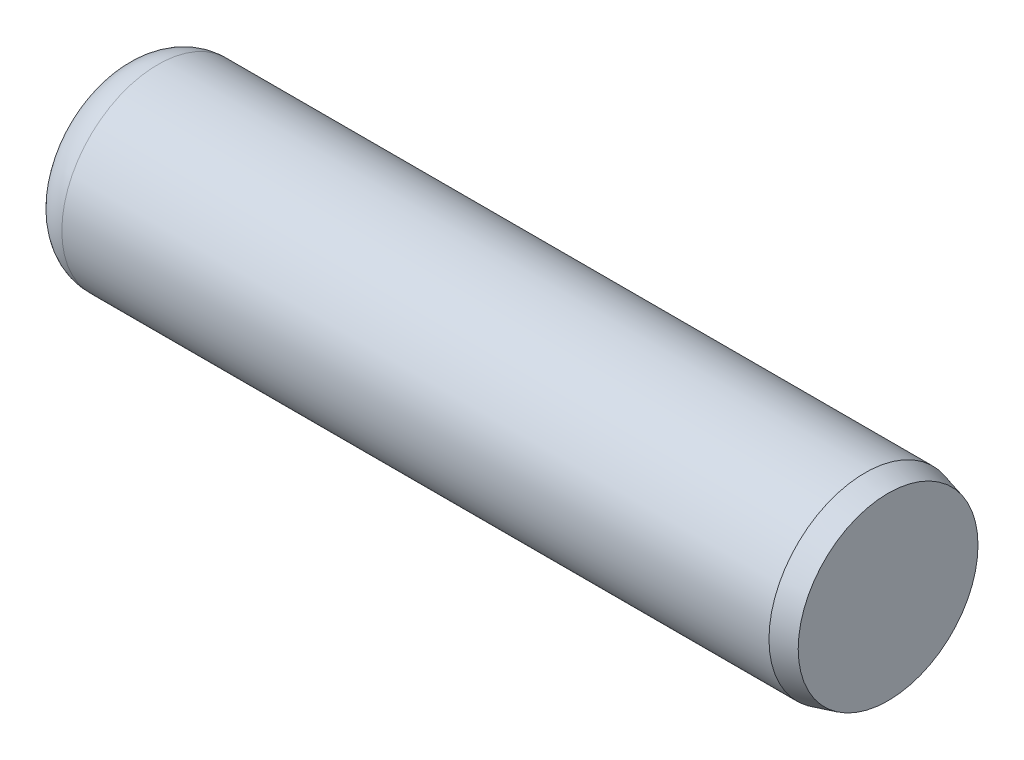
ISO-10303-21;
HEADER;
FILE_DESCRIPTION(('STEP AP214'),'2;1');
FILE_NAME('part.step','',(''),(''),'','','');
FILE_SCHEMA(('AUTOMOTIVE_DESIGN { 1 0 10303 214 1 1 1 1 }'));
ENDSEC;
DATA;
#1=APPLICATION_CONTEXT('core data for automotive mechanical design processes');
#2=APPLICATION_PROTOCOL_DEFINITION('international standard','automotive_design',2000,#1);
#3=PRODUCT_CONTEXT('',#1,'mechanical');
#4=PRODUCT('Part','Part','',(#3));
#5=PRODUCT_RELATED_PRODUCT_CATEGORY('part','',(#4));
#6=PRODUCT_DEFINITION_FORMATION('','',#4);
#7=PRODUCT_DEFINITION_CONTEXT('part definition',#1,'design');
#8=PRODUCT_DEFINITION('design','',#6,#7);
#9=PRODUCT_DEFINITION_SHAPE('','',#8);
#10=(LENGTH_UNIT() NAMED_UNIT(*) SI_UNIT(.MILLI.,.METRE.));
#11=(NAMED_UNIT(*) PLANE_ANGLE_UNIT() SI_UNIT($,.RADIAN.));
#12=(NAMED_UNIT(*) SI_UNIT($,.STERADIAN.) SOLID_ANGLE_UNIT());
#13=UNCERTAINTY_MEASURE_WITH_UNIT(LENGTH_MEASURE(1.E-05),#10,'distance_accuracy_value','');
#14=(GEOMETRIC_REPRESENTATION_CONTEXT(3) GLOBAL_UNCERTAINTY_ASSIGNED_CONTEXT((#13)) GLOBAL_UNIT_ASSIGNED_CONTEXT((#10,
#11,#12)) REPRESENTATION_CONTEXT('',''));
#15=CARTESIAN_POINT('',(0.,0.,0.));
#16=DIRECTION('',(0.,0.,1.));
#17=DIRECTION('',(1.,0.,0.));
#18=AXIS2_PLACEMENT_3D('',#15,#16,#17);
#19=CARTESIAN_POINT('',(0.,7.61999999999997,0.));
#20=DIRECTION('',(1.,0.,0.));
#21=DIRECTION('',(0.,0.,-1.));
#22=AXIS2_PLACEMENT_3D('',#19,#20,#21);
#23=PLANE('',#22);
#24=CARTESIAN_POINT('',(0.,0.,0.));
#25=DIRECTION('',(-1.,0.,0.));
#26=DIRECTION('',(0.,0.,1.));
#27=AXIS2_PLACEMENT_3D('',#24,#25,#26);
#28=CIRCLE('',#27,7.61999999999997);
#29=CARTESIAN_POINT('',(0.,0.,7.61999999999997));
#30=VERTEX_POINT('',#29);
#31=EDGE_CURVE('E44',#30,#30,#28,.T.);
#32=ORIENTED_EDGE('',*,*,#31,.T.);
#33=EDGE_LOOP('',(#32));
#34=FACE_BOUND('',#33,.T.);
#35=ADVANCED_FACE('F30',(#34),#23,.F.);
#36=CARTESIAN_POINT('',(101.6,0.,0.));
#37=DIRECTION('',(-1.,0.,0.));
#38=DIRECTION('',(0.,0.,1.));
#39=AXIS2_PLACEMENT_3D('',#36,#37,#38);
#40=PLANE('',#39);
#41=CARTESIAN_POINT('',(101.6,0.,0.));
#42=DIRECTION('',(-1.,0.,0.));
#43=DIRECTION('',(0.,0.,1.));
#44=AXIS2_PLACEMENT_3D('',#41,#42,#43);
#45=CIRCLE('',#44,11.8832908614699);
#46=CARTESIAN_POINT('',(101.6,0.,11.8832908614699));
#47=VERTEX_POINT('',#46);
#48=EDGE_CURVE('E10',#47,#47,#45,.T.);
#49=ORIENTED_EDGE('',*,*,#48,.F.);
#50=EDGE_LOOP('',(#49));
#51=FACE_BOUND('',#50,.T.);
#52=ADVANCED_FACE('F64',(#51),#40,.F.);
#53=CARTESIAN_POINT('',(101.6,0.,0.));
#54=DIRECTION('',(-1.,0.,0.));
#55=DIRECTION('',(0.,0.,1.));
#56=AXIS2_PLACEMENT_3D('',#53,#54,#55);
#57=CONICAL_SURFACE('',#56,11.8832908614699,0.26179938779915);
#58=CARTESIAN_POINT('',(98.552,0.,0.));
#59=DIRECTION('',(-1.,0.,0.));
#60=DIRECTION('',(0.,0.,1.));
#61=AXIS2_PLACEMENT_3D('',#58,#59,#60);
#62=CIRCLE('',#61,12.7);
#63=CARTESIAN_POINT('',(98.552,0.,12.7));
#64=VERTEX_POINT('',#63);
#65=EDGE_CURVE('E36',#64,#64,#62,.T.);
#66=ORIENTED_EDGE('',*,*,#65,.F.);
#67=EDGE_LOOP('',(#66));
#68=FACE_BOUND('',#67,.T.);
#69=ORIENTED_EDGE('',*,*,#48,.T.);
#70=EDGE_LOOP('',(#69));
#71=FACE_BOUND('',#70,.T.);
#72=ADVANCED_FACE('F59',(#68,#71),#57,.T.);
#73=CARTESIAN_POINT('',(-6.35,0.,0.));
#74=DIRECTION('',(-1.,0.,0.));
#75=DIRECTION('',(0.,0.,1.));
#76=AXIS2_PLACEMENT_3D('',#73,#74,#75);
#77=CYLINDRICAL_SURFACE('',#76,12.7);
#78=CARTESIAN_POINT('',(5.08,0.,0.));
#79=DIRECTION('',(-1.,0.,0.));
#80=DIRECTION('',(0.,0.,1.));
#81=AXIS2_PLACEMENT_3D('',#78,#79,#80);
#82=CIRCLE('',#81,12.7);
#83=CARTESIAN_POINT('',(5.08,0.,12.7));
#84=VERTEX_POINT('',#83);
#85=EDGE_CURVE('E40',#84,#84,#82,.T.);
#86=ORIENTED_EDGE('',*,*,#85,.F.);
#87=EDGE_LOOP('',(#86));
#88=FACE_BOUND('',#87,.T.);
#89=ORIENTED_EDGE('',*,*,#65,.T.);
#90=EDGE_LOOP('',(#89));
#91=FACE_BOUND('',#90,.T.);
#92=ADVANCED_FACE('F54',(#88,#91),#77,.T.);
#93=CARTESIAN_POINT('',(5.08,0.,0.));
#94=DIRECTION('',(-1.,0.,0.));
#95=DIRECTION('',(0.,0.,1.));
#96=AXIS2_PLACEMENT_3D('',#93,#94,#95);
#97=TOROIDAL_SURFACE('',#96,7.61999999999997,5.08);
#98=ORIENTED_EDGE('',*,*,#31,.F.);
#99=EDGE_LOOP('',(#98));
#100=FACE_BOUND('',#99,.T.);
#101=ORIENTED_EDGE('',*,*,#85,.T.);
#102=EDGE_LOOP('',(#101));
#103=FACE_BOUND('',#102,.T.);
#104=ADVANCED_FACE('F51',(#100,#103),#97,.T.);
#105=CLOSED_SHELL('',(#35,#52,#72,#92,#104));
#106=MANIFOLD_SOLID_BREP('B2',#105);
#107=ADVANCED_BREP_SHAPE_REPRESENTATION('',(#18,#106),#14);
#108=SHAPE_DEFINITION_REPRESENTATION(#9,#107);
ENDSEC;
END-ISO-10303-21;
